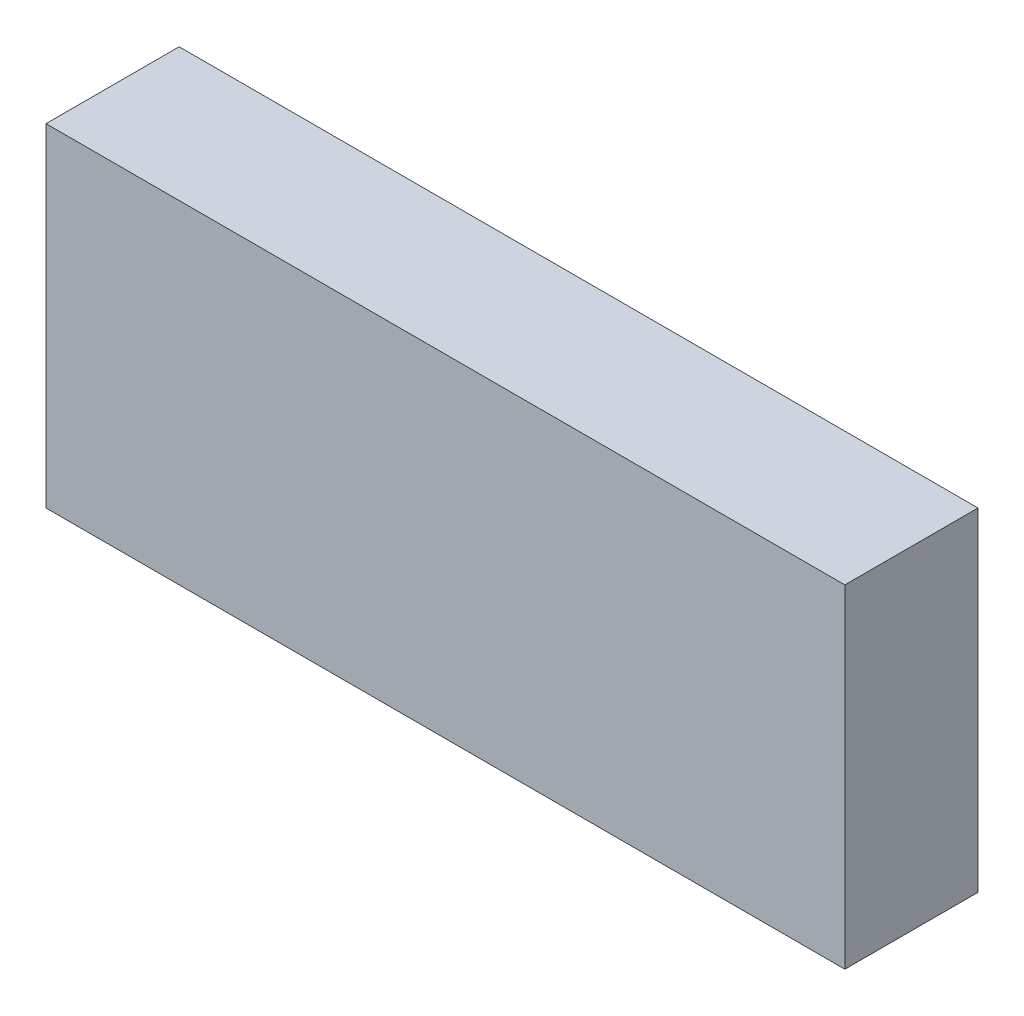
ISO-10303-21;
HEADER;
FILE_DESCRIPTION(('STEP AP214'),'2;1');
FILE_NAME('part.step','',(''),(''),'','','');
FILE_SCHEMA(('AUTOMOTIVE_DESIGN { 1 0 10303 214 1 1 1 1 }'));
ENDSEC;
DATA;
#1=APPLICATION_CONTEXT('core data for automotive mechanical design processes');
#2=APPLICATION_PROTOCOL_DEFINITION('international standard','automotive_design',2000,#1);
#3=PRODUCT_CONTEXT('',#1,'mechanical');
#4=PRODUCT('Part','Part','',(#3));
#5=PRODUCT_RELATED_PRODUCT_CATEGORY('part','',(#4));
#6=PRODUCT_DEFINITION_FORMATION('','',#4);
#7=PRODUCT_DEFINITION_CONTEXT('part definition',#1,'design');
#8=PRODUCT_DEFINITION('design','',#6,#7);
#9=PRODUCT_DEFINITION_SHAPE('','',#8);
#10=(LENGTH_UNIT() NAMED_UNIT(*) SI_UNIT(.MILLI.,.METRE.));
#11=(NAMED_UNIT(*) PLANE_ANGLE_UNIT() SI_UNIT($,.RADIAN.));
#12=(NAMED_UNIT(*) SI_UNIT($,.STERADIAN.) SOLID_ANGLE_UNIT());
#13=UNCERTAINTY_MEASURE_WITH_UNIT(LENGTH_MEASURE(1.E-05),#10,'distance_accuracy_value','');
#14=(GEOMETRIC_REPRESENTATION_CONTEXT(3) GLOBAL_UNCERTAINTY_ASSIGNED_CONTEXT((#13)) GLOBAL_UNIT_ASSIGNED_CONTEXT((#10,
#11,#12)) REPRESENTATION_CONTEXT('',''));
#15=CARTESIAN_POINT('',(0.,0.,0.));
#16=DIRECTION('',(0.,0.,1.));
#17=DIRECTION('',(1.,0.,0.));
#18=AXIS2_PLACEMENT_3D('',#15,#16,#17);
#19=CARTESIAN_POINT('',(30.,-12.5,10.));
#20=DIRECTION('',(-1.,0.,0.));
#21=DIRECTION('',(0.,0.,1.));
#22=AXIS2_PLACEMENT_3D('',#19,#20,#21);
#23=PLANE('',#22);
#24=DIRECTION('',(0.,1.,0.));
#25=VECTOR('',#24,1.);
#26=CARTESIAN_POINT('',(30.,-12.5,0.));
#27=LINE('',#26,#25);
#28=CARTESIAN_POINT('',(30.,-12.5,0.));
#29=VERTEX_POINT('',#28);
#30=CARTESIAN_POINT('',(30.,12.5,0.));
#31=VERTEX_POINT('',#30);
#32=EDGE_CURVE('E102',#29,#31,#27,.T.);
#33=ORIENTED_EDGE('',*,*,#32,.T.);
#34=DIRECTION('',(0.,0.,-1.));
#35=VECTOR('',#34,1.);
#36=CARTESIAN_POINT('',(30.,12.5,10.));
#37=LINE('',#36,#35);
#38=CARTESIAN_POINT('',(30.,12.5,10.));
#39=VERTEX_POINT('',#38);
#40=EDGE_CURVE('E11',#39,#31,#37,.T.);
#41=ORIENTED_EDGE('',*,*,#40,.F.);
#42=DIRECTION('',(0.,1.,0.));
#43=VECTOR('',#42,1.);
#44=CARTESIAN_POINT('',(30.,-12.5,10.));
#45=LINE('',#44,#43);
#46=CARTESIAN_POINT('',(30.,-12.5,10.));
#47=VERTEX_POINT('',#46);
#48=EDGE_CURVE('E90',#47,#39,#45,.T.);
#49=ORIENTED_EDGE('',*,*,#48,.F.);
#50=DIRECTION('',(0.,0.,-1.));
#51=VECTOR('',#50,1.);
#52=CARTESIAN_POINT('',(30.,-12.5,10.));
#53=LINE('',#52,#51);
#54=EDGE_CURVE('E98',#47,#29,#53,.T.);
#55=ORIENTED_EDGE('',*,*,#54,.T.);
#56=EDGE_LOOP('',(#33,#41,#49,#55));
#57=FACE_BOUND('',#56,.T.);
#58=ADVANCED_FACE('F39',(#57),#23,.F.);
#59=CARTESIAN_POINT('',(-30.,12.5,10.));
#60=DIRECTION('',(0.,-1.,0.));
#61=DIRECTION('',(0.,0.,-1.));
#62=AXIS2_PLACEMENT_3D('',#59,#60,#61);
#63=PLANE('',#62);
#64=DIRECTION('',(-1.,0.,0.));
#65=VECTOR('',#64,1.);
#66=CARTESIAN_POINT('',(-30.,12.5,0.));
#67=LINE('',#66,#65);
#68=CARTESIAN_POINT('',(-30.,12.5,0.));
#69=VERTEX_POINT('',#68);
#70=EDGE_CURVE('E94',#31,#69,#67,.T.);
#71=ORIENTED_EDGE('',*,*,#70,.T.);
#72=DIRECTION('',(0.,0.,-1.));
#73=VECTOR('',#72,1.);
#74=CARTESIAN_POINT('',(-30.,12.5,10.));
#75=LINE('',#74,#73);
#76=CARTESIAN_POINT('',(-30.,12.5,10.));
#77=VERTEX_POINT('',#76);
#78=EDGE_CURVE('E47',#77,#69,#75,.T.);
#79=ORIENTED_EDGE('',*,*,#78,.F.);
#80=DIRECTION('',(-1.,0.,0.));
#81=VECTOR('',#80,1.);
#82=CARTESIAN_POINT('',(-30.,12.5,10.));
#83=LINE('',#82,#81);
#84=EDGE_CURVE('E85',#39,#77,#83,.T.);
#85=ORIENTED_EDGE('',*,*,#84,.F.);
#86=ORIENTED_EDGE('',*,*,#40,.T.);
#87=EDGE_LOOP('',(#71,#79,#85,#86));
#88=FACE_BOUND('',#87,.T.);
#89=ADVANCED_FACE('F93',(#88),#63,.F.);
#90=CARTESIAN_POINT('',(-30.,-12.5,10.));
#91=DIRECTION('',(1.,0.,0.));
#92=DIRECTION('',(0.,0.,-1.));
#93=AXIS2_PLACEMENT_3D('',#90,#91,#92);
#94=PLANE('',#93);
#95=DIRECTION('',(0.,-1.,0.));
#96=VECTOR('',#95,1.);
#97=CARTESIAN_POINT('',(-30.,-12.5,0.));
#98=LINE('',#97,#96);
#99=CARTESIAN_POINT('',(-30.,-12.5,0.));
#100=VERTEX_POINT('',#99);
#101=EDGE_CURVE('E72',#69,#100,#98,.T.);
#102=ORIENTED_EDGE('',*,*,#101,.T.);
#103=DIRECTION('',(0.,0.,-1.));
#104=VECTOR('',#103,1.);
#105=CARTESIAN_POINT('',(-30.,-12.5,10.));
#106=LINE('',#105,#104);
#107=CARTESIAN_POINT('',(-30.,-12.5,10.));
#108=VERTEX_POINT('',#107);
#109=EDGE_CURVE('E95',#108,#100,#106,.T.);
#110=ORIENTED_EDGE('',*,*,#109,.F.);
#111=DIRECTION('',(0.,-1.,0.));
#112=VECTOR('',#111,1.);
#113=CARTESIAN_POINT('',(-30.,-12.5,10.));
#114=LINE('',#113,#112);
#115=EDGE_CURVE('E88',#77,#108,#114,.T.);
#116=ORIENTED_EDGE('',*,*,#115,.F.);
#117=ORIENTED_EDGE('',*,*,#78,.T.);
#118=EDGE_LOOP('',(#102,#110,#116,#117));
#119=FACE_BOUND('',#118,.T.);
#120=ADVANCED_FACE('F96',(#119),#94,.F.);
#121=CARTESIAN_POINT('',(-30.,-12.5,10.));
#122=DIRECTION('',(0.,1.,0.));
#123=DIRECTION('',(0.,0.,1.));
#124=AXIS2_PLACEMENT_3D('',#121,#122,#123);
#125=PLANE('',#124);
#126=DIRECTION('',(1.,0.,0.));
#127=VECTOR('',#126,1.);
#128=CARTESIAN_POINT('',(-30.,-12.5,0.));
#129=LINE('',#128,#127);
#130=EDGE_CURVE('E78',#100,#29,#129,.T.);
#131=ORIENTED_EDGE('',*,*,#130,.T.);
#132=ORIENTED_EDGE('',*,*,#54,.F.);
#133=DIRECTION('',(1.,0.,0.));
#134=VECTOR('',#133,1.);
#135=CARTESIAN_POINT('',(-30.,-12.5,10.));
#136=LINE('',#135,#134);
#137=EDGE_CURVE('E55',#108,#47,#136,.T.);
#138=ORIENTED_EDGE('',*,*,#137,.F.);
#139=ORIENTED_EDGE('',*,*,#109,.T.);
#140=EDGE_LOOP('',(#131,#132,#138,#139));
#141=FACE_BOUND('',#140,.T.);
#142=ADVANCED_FACE('F109',(#141),#125,.F.);
#143=CARTESIAN_POINT('',(0.,0.,10.));
#144=DIRECTION('',(0.,0.,-1.));
#145=DIRECTION('',(-1.,0.,0.));
#146=AXIS2_PLACEMENT_3D('',#143,#144,#145);
#147=PLANE('',#146);
#148=ORIENTED_EDGE('',*,*,#48,.T.);
#149=ORIENTED_EDGE('',*,*,#84,.T.);
#150=ORIENTED_EDGE('',*,*,#115,.T.);
#151=ORIENTED_EDGE('',*,*,#137,.T.);
#152=EDGE_LOOP('',(#148,#149,#150,#151));
#153=FACE_BOUND('',#152,.T.);
#154=ADVANCED_FACE('F86',(#153),#147,.F.);
#155=CARTESIAN_POINT('',(0.,0.,0.));
#156=DIRECTION('',(0.,0.,-1.));
#157=DIRECTION('',(-1.,0.,0.));
#158=AXIS2_PLACEMENT_3D('',#155,#156,#157);
#159=PLANE('',#158);
#160=ORIENTED_EDGE('',*,*,#32,.F.);
#161=ORIENTED_EDGE('',*,*,#130,.F.);
#162=ORIENTED_EDGE('',*,*,#101,.F.);
#163=ORIENTED_EDGE('',*,*,#70,.F.);
#164=EDGE_LOOP('',(#160,#161,#162,#163));
#165=FACE_BOUND('',#164,.T.);
#166=ADVANCED_FACE('F112',(#165),#159,.T.);
#167=CLOSED_SHELL('',(#58,#89,#120,#142,#154,#166));
#168=MANIFOLD_SOLID_BREP('B2',#167);
#169=ADVANCED_BREP_SHAPE_REPRESENTATION('',(#18,#168),#14);
#170=SHAPE_DEFINITION_REPRESENTATION(#9,#169);
ENDSEC;
END-ISO-10303-21;
